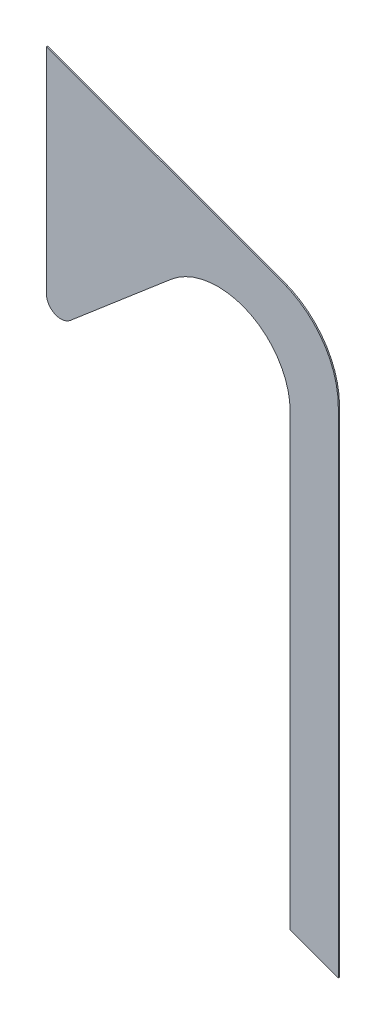
ISO-10303-21;
HEADER;
FILE_DESCRIPTION(('STEP AP214'),'2;1');
FILE_NAME('part.step','',(''),(''),'','','');
FILE_SCHEMA(('AUTOMOTIVE_DESIGN { 1 0 10303 214 1 1 1 1 }'));
ENDSEC;
DATA;
#1=APPLICATION_CONTEXT('core data for automotive mechanical design processes');
#2=APPLICATION_PROTOCOL_DEFINITION('international standard','automotive_design',2000,#1);
#3=PRODUCT_CONTEXT('',#1,'mechanical');
#4=PRODUCT('Part','Part','',(#3));
#5=PRODUCT_RELATED_PRODUCT_CATEGORY('part','',(#4));
#6=PRODUCT_DEFINITION_FORMATION('','',#4);
#7=PRODUCT_DEFINITION_CONTEXT('part definition',#1,'design');
#8=PRODUCT_DEFINITION('design','',#6,#7);
#9=PRODUCT_DEFINITION_SHAPE('','',#8);
#10=(LENGTH_UNIT() NAMED_UNIT(*) SI_UNIT(.MILLI.,.METRE.));
#11=(NAMED_UNIT(*) PLANE_ANGLE_UNIT() SI_UNIT($,.RADIAN.));
#12=(NAMED_UNIT(*) SI_UNIT($,.STERADIAN.) SOLID_ANGLE_UNIT());
#13=UNCERTAINTY_MEASURE_WITH_UNIT(LENGTH_MEASURE(1.E-05),#10,'distance_accuracy_value','');
#14=(GEOMETRIC_REPRESENTATION_CONTEXT(3) GLOBAL_UNCERTAINTY_ASSIGNED_CONTEXT((#13)) GLOBAL_UNIT_ASSIGNED_CONTEXT((#10,
#11,#12)) REPRESENTATION_CONTEXT('',''));
#15=CARTESIAN_POINT('',(0.,0.,0.));
#16=DIRECTION('',(0.,0.,1.));
#17=DIRECTION('',(1.,0.,0.));
#18=AXIS2_PLACEMENT_3D('',#15,#16,#17);
#19=CARTESIAN_POINT('',(2.396268684651,-1.745570629485,0.));
#20=DIRECTION('',(0.649169859684265,-0.760643473170915,0.));
#21=DIRECTION('',(0.760643473170915,0.649169859684265,0.));
#22=AXIS2_PLACEMENT_3D('',#19,#20,#21);
#23=PLANE('',#22);
#24=DIRECTION('',(0.760643473170915,0.649169859684265,0.));
#25=VECTOR('',#24,1.);
#26=CARTESIAN_POINT('',(2.396268684651,-1.745570629485,0.));
#27=LINE('',#26,#25);
#28=CARTESIAN_POINT('',(2.396268684651,-1.745570629485,0.));
#29=VERTEX_POINT('',#28);
#30=CARTESIAN_POINT('',(2.633008854287,-1.543525140205,0.));
#31=VERTEX_POINT('',#30);
#32=EDGE_CURVE('E11',#29,#31,#27,.T.);
#33=ORIENTED_EDGE('',*,*,#32,.T.);
#34=DIRECTION('',(0.,0.,1.));
#35=VECTOR('',#34,1.);
#36=CARTESIAN_POINT('',(2.633008854287,-1.543525140205,0.));
#37=LINE('',#36,#35);
#38=CARTESIAN_POINT('',(2.633008854287,-1.543525140205,0.003));
#39=VERTEX_POINT('',#38);
#40=EDGE_CURVE('E24',#31,#39,#37,.T.);
#41=ORIENTED_EDGE('',*,*,#40,.T.);
#42=DIRECTION('',(0.760643473170915,0.649169859684265,0.));
#43=VECTOR('',#42,1.);
#44=CARTESIAN_POINT('',(2.396268684651,-1.745570629485,0.003));
#45=LINE('',#44,#43);
#46=CARTESIAN_POINT('',(2.396268684651,-1.745570629485,0.003));
#47=VERTEX_POINT('',#46);
#48=EDGE_CURVE('E106',#47,#39,#45,.T.);
#49=ORIENTED_EDGE('',*,*,#48,.F.);
#50=DIRECTION('',(0.,0.,1.));
#51=VECTOR('',#50,1.);
#52=CARTESIAN_POINT('',(2.396268684651,-1.745570629485,0.));
#53=LINE('',#52,#51);
#54=EDGE_CURVE('E161',#29,#47,#53,.T.);
#55=ORIENTED_EDGE('',*,*,#54,.F.);
#56=EDGE_LOOP('',(#33,#41,#49,#55));
#57=FACE_BOUND('',#56,.T.);
#58=ADVANCED_FACE('F17',(#57),#23,.T.);
#59=CARTESIAN_POINT('',(2.374196909422,-1.719708751397,0.));
#60=DIRECTION('',(0.,0.,1.));
#61=DIRECTION('',(-1.,0.,0.));
#62=AXIS2_PLACEMENT_3D('',#59,#60,#61);
#63=CYLINDRICAL_SURFACE('',#62,0.034);
#64=CARTESIAN_POINT('',(2.374196909422,-1.719708751397,0.));
#65=DIRECTION('',(0.,0.,1.));
#66=DIRECTION('',(-1.,0.,0.));
#67=AXIS2_PLACEMENT_3D('',#64,#65,#66);
#68=CIRCLE('',#67,0.034);
#69=CARTESIAN_POINT('',(2.340196909422,-1.719708751397,0.));
#70=VERTEX_POINT('',#69);
#71=EDGE_CURVE('E158',#70,#29,#68,.T.);
#72=ORIENTED_EDGE('',*,*,#71,.T.);
#73=ORIENTED_EDGE('',*,*,#54,.T.);
#74=CARTESIAN_POINT('',(2.374196909422,-1.719708751397,0.003));
#75=DIRECTION('',(0.,0.,1.));
#76=DIRECTION('',(-1.,0.,0.));
#77=AXIS2_PLACEMENT_3D('',#74,#75,#76);
#78=CIRCLE('',#77,0.034);
#79=CARTESIAN_POINT('',(2.340196909422,-1.719708751397,0.003));
#80=VERTEX_POINT('',#79);
#81=EDGE_CURVE('E156',#80,#47,#78,.T.);
#82=ORIENTED_EDGE('',*,*,#81,.F.);
#83=DIRECTION('',(0.,0.,1.));
#84=VECTOR('',#83,1.);
#85=CARTESIAN_POINT('',(2.340196909422,-1.719708751397,0.));
#86=LINE('',#85,#84);
#87=EDGE_CURVE('E153',#70,#80,#86,.T.);
#88=ORIENTED_EDGE('',*,*,#87,.F.);
#89=EDGE_LOOP('',(#72,#73,#82,#88));
#90=FACE_BOUND('',#89,.T.);
#91=ADVANCED_FACE('F181',(#90),#63,.T.);
#92=CARTESIAN_POINT('',(2.340196909422,-1.216136079467,0.));
#93=DIRECTION('',(-1.,0.,0.));
#94=DIRECTION('',(0.,-1.,0.));
#95=AXIS2_PLACEMENT_3D('',#92,#93,#94);
#96=PLANE('',#95);
#97=DIRECTION('',(0.,-1.,0.));
#98=VECTOR('',#97,1.);
#99=CARTESIAN_POINT('',(2.340196909422,-1.216136079467,0.));
#100=LINE('',#99,#98);
#101=CARTESIAN_POINT('',(2.340196909422,-1.216136079467,0.));
#102=VERTEX_POINT('',#101);
#103=EDGE_CURVE('E150',#102,#70,#100,.T.);
#104=ORIENTED_EDGE('',*,*,#103,.T.);
#105=ORIENTED_EDGE('',*,*,#87,.T.);
#106=DIRECTION('',(0.,-1.,0.));
#107=VECTOR('',#106,1.);
#108=CARTESIAN_POINT('',(2.340196909422,-1.216136079467,0.003));
#109=LINE('',#108,#107);
#110=CARTESIAN_POINT('',(2.340196909422,-1.216136079467,0.003));
#111=VERTEX_POINT('',#110);
#112=EDGE_CURVE('E147',#111,#80,#109,.T.);
#113=ORIENTED_EDGE('',*,*,#112,.F.);
#114=DIRECTION('',(0.,0.,1.));
#115=VECTOR('',#114,1.);
#116=CARTESIAN_POINT('',(2.340196909422,-1.216136079467,0.));
#117=LINE('',#116,#115);
#118=EDGE_CURVE('E144',#102,#111,#117,.T.);
#119=ORIENTED_EDGE('',*,*,#118,.F.);
#120=EDGE_LOOP('',(#104,#105,#113,#119));
#121=FACE_BOUND('',#120,.T.);
#122=ADVANCED_FACE('F178',(#121),#96,.T.);
#123=CARTESIAN_POINT('',(2.89486737112,-1.418019617352,0.));
#124=DIRECTION('',(0.342020143325673,0.939692620785907,0.));
#125=DIRECTION('',(-0.939692620785907,0.342020143325673,0.));
#126=AXIS2_PLACEMENT_3D('',#123,#124,#125);
#127=PLANE('',#126);
#128=DIRECTION('',(-0.939692620785907,0.342020143325673,0.));
#129=VECTOR('',#128,1.);
#130=CARTESIAN_POINT('',(2.89486737112,-1.418019617352,0.));
#131=LINE('',#130,#129);
#132=CARTESIAN_POINT('',(2.89486737112,-1.418019617352,0.));
#133=VERTEX_POINT('',#132);
#134=EDGE_CURVE('E141',#133,#102,#131,.T.);
#135=ORIENTED_EDGE('',*,*,#134,.T.);
#136=ORIENTED_EDGE('',*,*,#118,.T.);
#137=DIRECTION('',(-0.939692620785907,0.342020143325673,0.));
#138=VECTOR('',#137,1.);
#139=CARTESIAN_POINT('',(2.89486737112,-1.418019617352,0.003));
#140=LINE('',#139,#138);
#141=CARTESIAN_POINT('',(2.89486737112,-1.418019617352,0.003));
#142=VERTEX_POINT('',#141);
#143=EDGE_CURVE('E138',#142,#111,#140,.T.);
#144=ORIENTED_EDGE('',*,*,#143,.F.);
#145=DIRECTION('',(0.,0.,1.));
#146=VECTOR('',#145,1.);
#147=CARTESIAN_POINT('',(2.89486737112,-1.418019617352,0.));
#148=LINE('',#147,#146);
#149=EDGE_CURVE('E135',#133,#142,#148,.T.);
#150=ORIENTED_EDGE('',*,*,#149,.F.);
#151=EDGE_LOOP('',(#135,#136,#144,#150));
#152=FACE_BOUND('',#151,.T.);
#153=ADVANCED_FACE('F175',(#152),#127,.T.);
#154=CARTESIAN_POINT('',(2.826463342455,-1.605958141509,0.));
#155=DIRECTION('',(0.,0.,1.));
#156=DIRECTION('',(1.,0.,0.));
#157=AXIS2_PLACEMENT_3D('',#154,#155,#156);
#158=CYLINDRICAL_SURFACE('',#157,0.2);
#159=CARTESIAN_POINT('',(2.826463342455,-1.605958141509,0.));
#160=DIRECTION('',(0.,0.,1.));
#161=DIRECTION('',(1.,0.,0.));
#162=AXIS2_PLACEMENT_3D('',#159,#160,#161);
#163=CIRCLE('',#162,0.2);
#164=CARTESIAN_POINT('',(3.026463342455,-1.605958141509,0.));
#165=VERTEX_POINT('',#164);
#166=EDGE_CURVE('E132',#165,#133,#163,.T.);
#167=ORIENTED_EDGE('',*,*,#166,.T.);
#168=ORIENTED_EDGE('',*,*,#149,.T.);
#169=CARTESIAN_POINT('',(2.826463342455,-1.605958141509,0.003));
#170=DIRECTION('',(0.,0.,1.));
#171=DIRECTION('',(1.,0.,0.));
#172=AXIS2_PLACEMENT_3D('',#169,#170,#171);
#173=CIRCLE('',#172,0.2);
#174=CARTESIAN_POINT('',(3.026463342455,-1.605958141509,0.003));
#175=VERTEX_POINT('',#174);
#176=EDGE_CURVE('E129',#175,#142,#173,.T.);
#177=ORIENTED_EDGE('',*,*,#176,.F.);
#178=DIRECTION('',(0.,0.,1.));
#179=VECTOR('',#178,1.);
#180=CARTESIAN_POINT('',(3.026463342455,-1.605958141509,0.));
#181=LINE('',#180,#179);
#182=EDGE_CURVE('E126',#165,#175,#181,.T.);
#183=ORIENTED_EDGE('',*,*,#182,.F.);
#184=EDGE_LOOP('',(#167,#168,#177,#183));
#185=FACE_BOUND('',#184,.T.);
#186=ADVANCED_FACE('F172',(#185),#158,.T.);
#187=CARTESIAN_POINT('',(3.026463342455,-2.769773453912,0.));
#188=DIRECTION('',(1.,0.,0.));
#189=DIRECTION('',(0.,1.,0.));
#190=AXIS2_PLACEMENT_3D('',#187,#188,#189);
#191=PLANE('',#190);
#192=DIRECTION('',(0.,1.,0.));
#193=VECTOR('',#192,1.);
#194=CARTESIAN_POINT('',(3.026463342455,-2.769773453912,0.));
#195=LINE('',#194,#193);
#196=CARTESIAN_POINT('',(3.026463342455,-2.769773453912,0.));
#197=VERTEX_POINT('',#196);
#198=EDGE_CURVE('E123',#197,#165,#195,.T.);
#199=ORIENTED_EDGE('',*,*,#198,.T.);
#200=ORIENTED_EDGE('',*,*,#182,.T.);
#201=DIRECTION('',(0.,1.,0.));
#202=VECTOR('',#201,1.);
#203=CARTESIAN_POINT('',(3.026463342455,-2.769773453912,0.003));
#204=LINE('',#203,#202);
#205=CARTESIAN_POINT('',(3.026463342455,-2.769773453912,0.003));
#206=VERTEX_POINT('',#205);
#207=EDGE_CURVE('E120',#206,#175,#204,.T.);
#208=ORIENTED_EDGE('',*,*,#207,.F.);
#209=DIRECTION('',(0.,0.,1.));
#210=VECTOR('',#209,1.);
#211=CARTESIAN_POINT('',(3.026463342455,-2.769773453912,0.));
#212=LINE('',#211,#210);
#213=EDGE_CURVE('E117',#197,#206,#212,.T.);
#214=ORIENTED_EDGE('',*,*,#213,.F.);
#215=EDGE_LOOP('',(#199,#200,#208,#214));
#216=FACE_BOUND('',#215,.T.);
#217=ADVANCED_FACE('F169',(#216),#191,.T.);
#218=CARTESIAN_POINT('',(2.913367730433,-2.72861001751,0.));
#219=DIRECTION('',(-0.342020143325595,-0.939692620785935,0.));
#220=DIRECTION('',(0.939692620785935,-0.342020143325595,0.));
#221=AXIS2_PLACEMENT_3D('',#218,#219,#220);
#222=PLANE('',#221);
#223=DIRECTION('',(0.939692620785935,-0.342020143325595,0.));
#224=VECTOR('',#223,1.);
#225=CARTESIAN_POINT('',(2.913367730433,-2.72861001751,0.));
#226=LINE('',#225,#224);
#227=CARTESIAN_POINT('',(2.913367730433,-2.72861001751,0.));
#228=VERTEX_POINT('',#227);
#229=EDGE_CURVE('E114',#228,#197,#226,.T.);
#230=ORIENTED_EDGE('',*,*,#229,.T.);
#231=ORIENTED_EDGE('',*,*,#213,.T.);
#232=DIRECTION('',(0.939692620785935,-0.342020143325595,0.));
#233=VECTOR('',#232,1.);
#234=CARTESIAN_POINT('',(2.913367730433,-2.72861001751,0.003));
#235=LINE('',#234,#233);
#236=CARTESIAN_POINT('',(2.913367730433,-2.72861001751,0.003));
#237=VERTEX_POINT('',#236);
#238=EDGE_CURVE('E112',#237,#206,#235,.T.);
#239=ORIENTED_EDGE('',*,*,#238,.F.);
#240=DIRECTION('',(0.,0.,1.));
#241=VECTOR('',#240,1.);
#242=CARTESIAN_POINT('',(2.913367730433,-2.72861001751,0.));
#243=LINE('',#242,#241);
#244=EDGE_CURVE('E91',#228,#237,#243,.T.);
#245=ORIENTED_EDGE('',*,*,#244,.F.);
#246=EDGE_LOOP('',(#230,#231,#239,#245));
#247=FACE_BOUND('',#246,.T.);
#248=ADVANCED_FACE('F167',(#247),#222,.T.);
#249=CARTESIAN_POINT('',(2.913367730433,-1.672834530644,0.));
#250=DIRECTION('',(-1.,0.,0.));
#251=DIRECTION('',(0.,-1.,0.));
#252=AXIS2_PLACEMENT_3D('',#249,#250,#251);
#253=PLANE('',#252);
#254=DIRECTION('',(0.,-1.,0.));
#255=VECTOR('',#254,1.);
#256=CARTESIAN_POINT('',(2.913367730433,-1.672834530644,0.));
#257=LINE('',#256,#255);
#258=CARTESIAN_POINT('',(2.913367730433,-1.672834530644,0.));
#259=VERTEX_POINT('',#258);
#260=EDGE_CURVE('E95',#259,#228,#257,.T.);
#261=ORIENTED_EDGE('',*,*,#260,.T.);
#262=ORIENTED_EDGE('',*,*,#244,.T.);
#263=DIRECTION('',(0.,-1.,0.));
#264=VECTOR('',#263,1.);
#265=CARTESIAN_POINT('',(2.913367730433,-1.672834530644,0.003));
#266=LINE('',#265,#264);
#267=CARTESIAN_POINT('',(2.913367730433,-1.672834530644,0.003));
#268=VERTEX_POINT('',#267);
#269=EDGE_CURVE('E84',#268,#237,#266,.T.);
#270=ORIENTED_EDGE('',*,*,#269,.F.);
#271=DIRECTION('',(0.,0.,1.));
#272=VECTOR('',#271,1.);
#273=CARTESIAN_POINT('',(2.913367730433,-1.672834530644,0.));
#274=LINE('',#273,#272);
#275=EDGE_CURVE('E88',#259,#268,#274,.T.);
#276=ORIENTED_EDGE('',*,*,#275,.F.);
#277=EDGE_LOOP('',(#261,#262,#270,#276));
#278=FACE_BOUND('',#277,.T.);
#279=ADVANCED_FACE('F87',(#278),#253,.T.);
#280=CARTESIAN_POINT('',(2.743367730433,-1.672834530644,0.));
#281=DIRECTION('',(0.,0.,1.));
#282=DIRECTION('',(-1.,0.,0.));
#283=AXIS2_PLACEMENT_3D('',#280,#281,#282);
#284=CYLINDRICAL_SURFACE('',#283,0.17);
#285=CARTESIAN_POINT('',(2.743367730433,-1.672834530644,0.));
#286=DIRECTION('',(0.,0.,-1.));
#287=DIRECTION('',(-1.,0.,0.));
#288=AXIS2_PLACEMENT_3D('',#285,#286,#287);
#289=CIRCLE('',#288,0.17);
#290=EDGE_CURVE('E101',#31,#259,#289,.T.);
#291=ORIENTED_EDGE('',*,*,#290,.T.);
#292=ORIENTED_EDGE('',*,*,#275,.T.);
#293=CARTESIAN_POINT('',(2.743367730433,-1.672834530644,0.003));
#294=DIRECTION('',(0.,0.,-1.));
#295=DIRECTION('',(-1.,0.,0.));
#296=AXIS2_PLACEMENT_3D('',#293,#294,#295);
#297=CIRCLE('',#296,0.17);
#298=EDGE_CURVE('E100',#39,#268,#297,.T.);
#299=ORIENTED_EDGE('',*,*,#298,.F.);
#300=ORIENTED_EDGE('',*,*,#40,.F.);
#301=EDGE_LOOP('',(#291,#292,#299,#300));
#302=FACE_BOUND('',#301,.T.);
#303=ADVANCED_FACE('F99',(#302),#284,.F.);
#304=CARTESIAN_POINT('',(2.683330125938,-1.99295476669,0.003));
#305=DIRECTION('',(0.,0.,1.));
#306=DIRECTION('',(1.,0.,0.));
#307=AXIS2_PLACEMENT_3D('',#304,#305,#306);
#308=PLANE('',#307);
#309=ORIENTED_EDGE('',*,*,#298,.T.);
#310=ORIENTED_EDGE('',*,*,#269,.T.);
#311=ORIENTED_EDGE('',*,*,#238,.T.);
#312=ORIENTED_EDGE('',*,*,#207,.T.);
#313=ORIENTED_EDGE('',*,*,#176,.T.);
#314=ORIENTED_EDGE('',*,*,#143,.T.);
#315=ORIENTED_EDGE('',*,*,#112,.T.);
#316=ORIENTED_EDGE('',*,*,#81,.T.);
#317=ORIENTED_EDGE('',*,*,#48,.T.);
#318=EDGE_LOOP('',(#309,#310,#311,#312,#313,#314,#315,#316,#317));
#319=FACE_BOUND('',#318,.T.);
#320=ADVANCED_FACE('F104',(#319),#308,.T.);
#321=CARTESIAN_POINT('',(2.683330125938,-1.99295476669,0.));
#322=DIRECTION('',(0.,0.,1.));
#323=DIRECTION('',(1.,0.,0.));
#324=AXIS2_PLACEMENT_3D('',#321,#322,#323);
#325=PLANE('',#324);
#326=ORIENTED_EDGE('',*,*,#290,.F.);
#327=ORIENTED_EDGE('',*,*,#32,.F.);
#328=ORIENTED_EDGE('',*,*,#71,.F.);
#329=ORIENTED_EDGE('',*,*,#103,.F.);
#330=ORIENTED_EDGE('',*,*,#134,.F.);
#331=ORIENTED_EDGE('',*,*,#166,.F.);
#332=ORIENTED_EDGE('',*,*,#198,.F.);
#333=ORIENTED_EDGE('',*,*,#229,.F.);
#334=ORIENTED_EDGE('',*,*,#260,.F.);
#335=EDGE_LOOP('',(#326,#327,#328,#329,#330,#331,#332,#333,#334));
#336=FACE_BOUND('',#335,.T.);
#337=ADVANCED_FACE('F164',(#336),#325,.F.);
#338=CLOSED_SHELL('',(#58,#91,#122,#153,#186,#217,#248,#279,#303,#320,#337));
#339=MANIFOLD_SOLID_BREP('B1',#338);
#340=ADVANCED_BREP_SHAPE_REPRESENTATION('',(#18,#339),#14);
#341=SHAPE_DEFINITION_REPRESENTATION(#9,#340);
ENDSEC;
END-ISO-10303-21;
